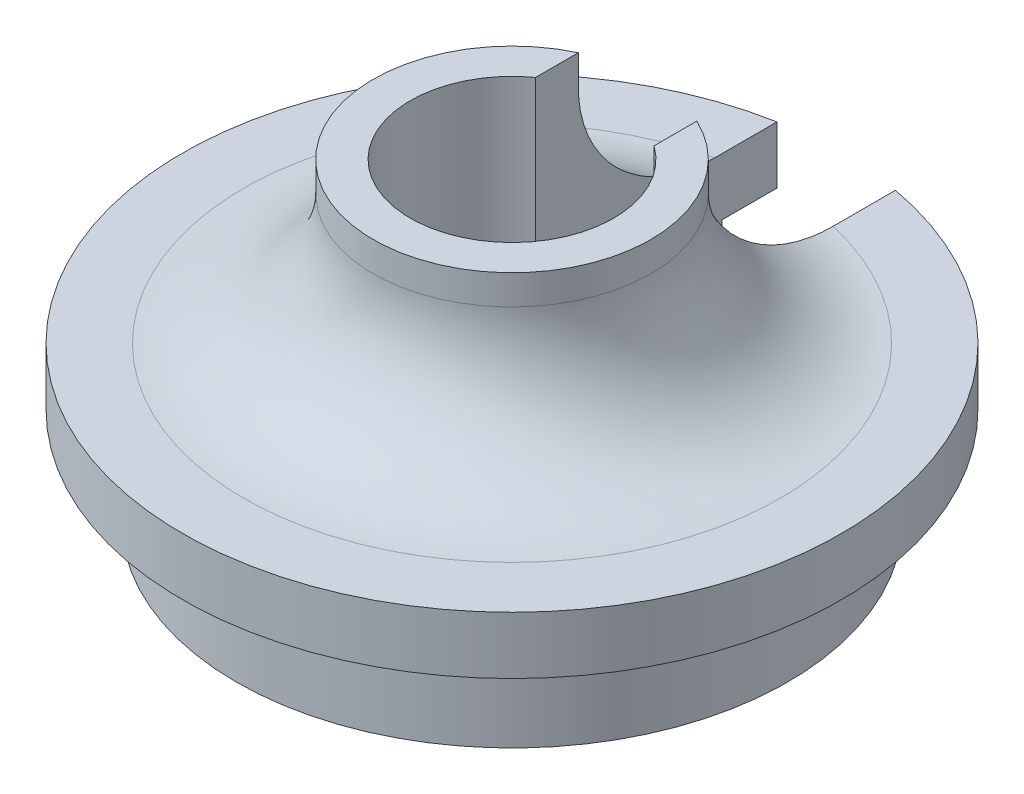
ISO-10303-21;
HEADER;
FILE_DESCRIPTION(('STEP AP214'),'2;1');
FILE_NAME('part.step','',(''),(''),'','','');
FILE_SCHEMA(('AUTOMOTIVE_DESIGN { 1 0 10303 214 1 1 1 1 }'));
ENDSEC;
DATA;
#1=APPLICATION_CONTEXT('core data for automotive mechanical design processes');
#2=APPLICATION_PROTOCOL_DEFINITION('international standard','automotive_design',2000,#1);
#3=PRODUCT_CONTEXT('',#1,'mechanical');
#4=PRODUCT('Part','Part','',(#3));
#5=PRODUCT_RELATED_PRODUCT_CATEGORY('part','',(#4));
#6=PRODUCT_DEFINITION_FORMATION('','',#4);
#7=PRODUCT_DEFINITION_CONTEXT('part definition',#1,'design');
#8=PRODUCT_DEFINITION('design','',#6,#7);
#9=PRODUCT_DEFINITION_SHAPE('','',#8);
#10=(LENGTH_UNIT() NAMED_UNIT(*) SI_UNIT(.MILLI.,.METRE.));
#11=(NAMED_UNIT(*) PLANE_ANGLE_UNIT() SI_UNIT($,.RADIAN.));
#12=(NAMED_UNIT(*) SI_UNIT($,.STERADIAN.) SOLID_ANGLE_UNIT());
#13=UNCERTAINTY_MEASURE_WITH_UNIT(LENGTH_MEASURE(1.E-05),#10,'distance_accuracy_value','');
#14=(GEOMETRIC_REPRESENTATION_CONTEXT(3) GLOBAL_UNCERTAINTY_ASSIGNED_CONTEXT((#13)) GLOBAL_UNIT_ASSIGNED_CONTEXT((#10,
#11,#12)) REPRESENTATION_CONTEXT('',''));
#15=CARTESIAN_POINT('',(0.,0.,0.));
#16=DIRECTION('',(0.,0.,1.));
#17=DIRECTION('',(1.,0.,0.));
#18=AXIS2_PLACEMENT_3D('',#15,#16,#17);
#19=CARTESIAN_POINT('',(0.,-1.55,-6.65));
#20=DIRECTION('',(0.,-1.,0.));
#21=DIRECTION('',(0.,0.,-1.));
#22=AXIS2_PLACEMENT_3D('',#19,#20,#21);
#23=PLANE('',#22);
#24=CARTESIAN_POINT('',(4.3301270189222,-1.55,-2.49999999999998));
#25=DIRECTION('',(0.,-1.,0.));
#26=DIRECTION('',(0.,0.,-1.));
#27=AXIS2_PLACEMENT_3D('',#24,#25,#26);
#28=CIRCLE('',#27,0.999999999999996);
#29=CARTESIAN_POINT('',(4.3301270189222,-1.55,-3.49999999999997));
#30=VERTEX_POINT('',#29);
#31=EDGE_CURVE('E350',#30,#30,#28,.T.);
#32=ORIENTED_EDGE('',*,*,#31,.F.);
#33=EDGE_LOOP('',(#32));
#34=FACE_BOUND('',#33,.T.);
#35=CARTESIAN_POINT('',(4.3301270189222,-1.55,2.50000000000003));
#36=DIRECTION('',(0.,-1.,0.));
#37=DIRECTION('',(0.,0.,-1.));
#38=AXIS2_PLACEMENT_3D('',#35,#36,#37);
#39=CIRCLE('',#38,0.999999999999994);
#40=CARTESIAN_POINT('',(4.3301270189222,-1.55,1.50000000000004));
#41=VERTEX_POINT('',#40);
#42=EDGE_CURVE('E354',#41,#41,#39,.T.);
#43=ORIENTED_EDGE('',*,*,#42,.F.);
#44=EDGE_LOOP('',(#43));
#45=FACE_BOUND('',#44,.T.);
#46=CARTESIAN_POINT('',(0.,-1.55,5.00000000000004));
#47=DIRECTION('',(0.,-1.,0.));
#48=DIRECTION('',(0.,0.,-1.));
#49=AXIS2_PLACEMENT_3D('',#46,#47,#48);
#50=CIRCLE('',#49,0.999999999999994);
#51=CARTESIAN_POINT('',(0.,-1.55,4.00000000000005));
#52=VERTEX_POINT('',#51);
#53=EDGE_CURVE('E358',#52,#52,#50,.T.);
#54=ORIENTED_EDGE('',*,*,#53,.F.);
#55=EDGE_LOOP('',(#54));
#56=FACE_BOUND('',#55,.T.);
#57=CARTESIAN_POINT('',(-4.3301270189222,-1.55,2.50000000000004));
#58=DIRECTION('',(0.,-1.,0.));
#59=DIRECTION('',(0.,0.,-1.));
#60=AXIS2_PLACEMENT_3D('',#57,#58,#59);
#61=CIRCLE('',#60,0.999999999999999);
#62=CARTESIAN_POINT('',(-4.3301270189222,-1.55,1.50000000000004));
#63=VERTEX_POINT('',#62);
#64=EDGE_CURVE('E362',#63,#63,#61,.T.);
#65=ORIENTED_EDGE('',*,*,#64,.F.);
#66=EDGE_LOOP('',(#65));
#67=FACE_BOUND('',#66,.T.);
#68=CARTESIAN_POINT('',(-4.33012701892221,-1.55,-2.49999999999997));
#69=DIRECTION('',(0.,-1.,0.));
#70=DIRECTION('',(0.,0.,-1.));
#71=AXIS2_PLACEMENT_3D('',#68,#69,#70);
#72=CIRCLE('',#71,1.);
#73=CARTESIAN_POINT('',(-4.33012701892221,-1.55,-3.49999999999997));
#74=VERTEX_POINT('',#73);
#75=EDGE_CURVE('E366',#74,#74,#72,.T.);
#76=ORIENTED_EDGE('',*,*,#75,.F.);
#77=EDGE_LOOP('',(#76));
#78=FACE_BOUND('',#77,.T.);
#79=DIRECTION('',(0.,0.,1.));
#80=VECTOR('',#79,1.);
#81=CARTESIAN_POINT('',(1.6,-1.55,-6.65));
#82=LINE('',#81,#80);
#83=CARTESIAN_POINT('',(1.6,-1.55,-6.45464948699773));
#84=VERTEX_POINT('',#83);
#85=CARTESIAN_POINT('',(1.6,-1.55,0.));
#86=VERTEX_POINT('',#85);
#87=EDGE_CURVE('E185',#84,#86,#82,.T.);
#88=ORIENTED_EDGE('',*,*,#87,.F.);
#89=CARTESIAN_POINT('',(0.,-1.55,0.));
#90=DIRECTION('',(0.,-1.,0.));
#91=DIRECTION('',(0.,0.,-1.));
#92=AXIS2_PLACEMENT_3D('',#89,#90,#91);
#93=CIRCLE('',#92,6.65);
#94=CARTESIAN_POINT('',(-1.6,-1.55,-6.45464948699773));
#95=VERTEX_POINT('',#94);
#96=EDGE_CURVE('E160',#84,#95,#93,.T.);
#97=ORIENTED_EDGE('',*,*,#96,.T.);
#98=DIRECTION('',(0.,0.,-1.));
#99=VECTOR('',#98,1.);
#100=CARTESIAN_POINT('',(-1.6,-1.55,-6.65));
#101=LINE('',#100,#99);
#102=CARTESIAN_POINT('',(-1.6,-1.55,0.));
#103=VERTEX_POINT('',#102);
#104=EDGE_CURVE('E138',#103,#95,#101,.T.);
#105=ORIENTED_EDGE('',*,*,#104,.F.);
#106=CARTESIAN_POINT('',(0.,-1.55,0.));
#107=DIRECTION('',(0.,-1.,0.));
#108=DIRECTION('',(0.,0.,-1.));
#109=AXIS2_PLACEMENT_3D('',#106,#107,#108);
#110=CIRCLE('',#109,1.6);
#111=EDGE_CURVE('E195',#86,#103,#110,.T.);
#112=ORIENTED_EDGE('',*,*,#111,.F.);
#113=EDGE_LOOP('',(#88,#97,#105,#112));
#114=FACE_BOUND('',#113,.T.);
#115=ADVANCED_FACE('F39',(#34,#45,#56,#67,#78,#114),#23,.T.);
#116=CARTESIAN_POINT('',(0.,-1.55,0.));
#117=DIRECTION('',(0.,-1.,0.));
#118=DIRECTION('',(0.,0.,-1.));
#119=AXIS2_PLACEMENT_3D('',#116,#117,#118);
#120=CYLINDRICAL_SURFACE('',#119,6.65);
#121=DIRECTION('',(0.,-1.,0.));
#122=VECTOR('',#121,1.);
#123=CARTESIAN_POINT('',(1.6,-1.55,-6.45464948699773));
#124=LINE('',#123,#122);
#125=CARTESIAN_POINT('',(1.6,-4.2,-6.45464948699773));
#126=VERTEX_POINT('',#125);
#127=EDGE_CURVE('E62',#126,#84,#124,.F.);
#128=ORIENTED_EDGE('',*,*,#127,.F.);
#129=CARTESIAN_POINT('',(0.,-4.2,0.));
#130=DIRECTION('',(0.,-1.,0.));
#131=DIRECTION('',(0.,0.,-1.));
#132=AXIS2_PLACEMENT_3D('',#129,#130,#131);
#133=CIRCLE('',#132,6.65);
#134=CARTESIAN_POINT('',(-1.6,-4.2,-6.45464948699773));
#135=VERTEX_POINT('',#134);
#136=EDGE_CURVE('E151',#126,#135,#133,.T.);
#137=ORIENTED_EDGE('',*,*,#136,.T.);
#138=DIRECTION('',(0.,-1.,0.));
#139=VECTOR('',#138,1.);
#140=CARTESIAN_POINT('',(-1.6,-1.55,-6.45464948699773));
#141=LINE('',#140,#139);
#142=EDGE_CURVE('E131',#95,#135,#141,.T.);
#143=ORIENTED_EDGE('',*,*,#142,.F.);
#144=ORIENTED_EDGE('',*,*,#96,.F.);
#145=EDGE_LOOP('',(#128,#137,#143,#144));
#146=FACE_BOUND('',#145,.T.);
#147=ADVANCED_FACE('F158',(#146),#120,.F.);
#148=CARTESIAN_POINT('',(0.,-4.2,-7.45));
#149=DIRECTION('',(0.,-1.,0.));
#150=DIRECTION('',(0.,0.,-1.));
#151=AXIS2_PLACEMENT_3D('',#148,#149,#150);
#152=PLANE('',#151);
#153=DIRECTION('',(0.,0.,1.));
#154=VECTOR('',#153,1.);
#155=CARTESIAN_POINT('',(1.6,-4.2,0.));
#156=LINE('',#155,#154);
#157=CARTESIAN_POINT('',(1.6,-4.2,-7.27615970138094));
#158=VERTEX_POINT('',#157);
#159=EDGE_CURVE('E155',#158,#126,#156,.T.);
#160=ORIENTED_EDGE('',*,*,#159,.F.);
#161=CARTESIAN_POINT('',(0.,-4.2,0.));
#162=DIRECTION('',(0.,-1.,0.));
#163=DIRECTION('',(0.,0.,-1.));
#164=AXIS2_PLACEMENT_3D('',#161,#162,#163);
#165=CIRCLE('',#164,7.45);
#166=CARTESIAN_POINT('',(-1.6,-4.2,-7.27615970138094));
#167=VERTEX_POINT('',#166);
#168=EDGE_CURVE('E153',#158,#167,#165,.T.);
#169=ORIENTED_EDGE('',*,*,#168,.T.);
#170=DIRECTION('',(0.,0.,-1.));
#171=VECTOR('',#170,1.);
#172=CARTESIAN_POINT('',(-1.6,-4.2,0.));
#173=LINE('',#172,#171);
#174=EDGE_CURVE('E134',#135,#167,#173,.T.);
#175=ORIENTED_EDGE('',*,*,#174,.F.);
#176=ORIENTED_EDGE('',*,*,#136,.F.);
#177=EDGE_LOOP('',(#160,#169,#175,#176));
#178=FACE_BOUND('',#177,.T.);
#179=ADVANCED_FACE('F150',(#178),#152,.T.);
#180=CARTESIAN_POINT('',(0.,-1.55,0.));
#181=DIRECTION('',(0.,-1.,0.));
#182=DIRECTION('',(0.,0.,-1.));
#183=AXIS2_PLACEMENT_3D('',#180,#181,#182);
#184=CYLINDRICAL_SURFACE('',#183,7.45);
#185=DIRECTION('',(0.,-1.,0.));
#186=VECTOR('',#185,1.);
#187=CARTESIAN_POINT('',(1.6,-1.55,-7.27615970138094));
#188=LINE('',#187,#186);
#189=CARTESIAN_POINT('',(1.6,-1.55,-7.27615970138094));
#190=VERTEX_POINT('',#189);
#191=EDGE_CURVE('E229',#190,#158,#188,.T.);
#192=ORIENTED_EDGE('',*,*,#191,.F.);
#193=CARTESIAN_POINT('',(0.,-1.55,0.));
#194=DIRECTION('',(0.,-1.,0.));
#195=DIRECTION('',(0.,0.,-1.));
#196=AXIS2_PLACEMENT_3D('',#193,#194,#195);
#197=CIRCLE('',#196,7.45);
#198=CARTESIAN_POINT('',(-1.6,-1.55,-7.27615970138094));
#199=VERTEX_POINT('',#198);
#200=EDGE_CURVE('E166',#190,#199,#197,.T.);
#201=ORIENTED_EDGE('',*,*,#200,.T.);
#202=DIRECTION('',(0.,-1.,0.));
#203=VECTOR('',#202,1.);
#204=CARTESIAN_POINT('',(-1.6,-1.55,-7.27615970138094));
#205=LINE('',#204,#203);
#206=EDGE_CURVE('E144',#167,#199,#205,.F.);
#207=ORIENTED_EDGE('',*,*,#206,.F.);
#208=ORIENTED_EDGE('',*,*,#168,.F.);
#209=EDGE_LOOP('',(#192,#201,#207,#208));
#210=FACE_BOUND('',#209,.T.);
#211=ADVANCED_FACE('F228',(#210),#184,.T.);
#212=CARTESIAN_POINT('',(0.,-1.55,-8.9));
#213=DIRECTION('',(0.,-1.,0.));
#214=DIRECTION('',(0.,0.,-1.));
#215=AXIS2_PLACEMENT_3D('',#212,#213,#214);
#216=PLANE('',#215);
#217=DIRECTION('',(0.,0.,1.));
#218=VECTOR('',#217,1.);
#219=CARTESIAN_POINT('',(1.6,-1.55,-8.9));
#220=LINE('',#219,#218);
#221=CARTESIAN_POINT('',(1.6,-1.55,-8.75499857224431));
#222=VERTEX_POINT('',#221);
#223=EDGE_CURVE('E234',#222,#190,#220,.T.);
#224=ORIENTED_EDGE('',*,*,#223,.F.);
#225=CARTESIAN_POINT('',(0.,-1.55,0.));
#226=DIRECTION('',(0.,-1.,0.));
#227=DIRECTION('',(0.,0.,-1.));
#228=AXIS2_PLACEMENT_3D('',#225,#226,#227);
#229=CIRCLE('',#228,8.9);
#230=CARTESIAN_POINT('',(-1.6,-1.55,-8.75499857224431));
#231=VERTEX_POINT('',#230);
#232=EDGE_CURVE('E220',#222,#231,#229,.T.);
#233=ORIENTED_EDGE('',*,*,#232,.T.);
#234=DIRECTION('',(0.,0.,-1.));
#235=VECTOR('',#234,1.);
#236=CARTESIAN_POINT('',(-1.6,-1.55,-8.9));
#237=LINE('',#236,#235);
#238=EDGE_CURVE('E236',#199,#231,#237,.T.);
#239=ORIENTED_EDGE('',*,*,#238,.F.);
#240=ORIENTED_EDGE('',*,*,#200,.F.);
#241=EDGE_LOOP('',(#224,#233,#239,#240));
#242=FACE_BOUND('',#241,.T.);
#243=ADVANCED_FACE('F233',(#242),#216,.T.);
#244=CARTESIAN_POINT('',(0.,-1.55,0.));
#245=DIRECTION('',(0.,-1.,0.));
#246=DIRECTION('',(0.,0.,-1.));
#247=AXIS2_PLACEMENT_3D('',#244,#245,#246);
#248=CYLINDRICAL_SURFACE('',#247,8.9);
#249=DIRECTION('',(0.,-1.,0.));
#250=VECTOR('',#249,1.);
#251=CARTESIAN_POINT('',(1.6,-1.55,-8.75499857224431));
#252=LINE('',#251,#250);
#253=CARTESIAN_POINT('',(1.6,0.,-8.75499857224431));
#254=VERTEX_POINT('',#253);
#255=EDGE_CURVE('E303',#254,#222,#252,.T.);
#256=ORIENTED_EDGE('',*,*,#255,.F.);
#257=CARTESIAN_POINT('',(0.,0.,0.));
#258=DIRECTION('',(0.,-1.,0.));
#259=DIRECTION('',(0.,0.,-1.));
#260=AXIS2_PLACEMENT_3D('',#257,#258,#259);
#261=CIRCLE('',#260,8.9);
#262=CARTESIAN_POINT('',(-1.6,0.,-8.75499857224431));
#263=VERTEX_POINT('',#262);
#264=EDGE_CURVE('E216',#254,#263,#261,.T.);
#265=ORIENTED_EDGE('',*,*,#264,.T.);
#266=DIRECTION('',(0.,-1.,0.));
#267=VECTOR('',#266,1.);
#268=CARTESIAN_POINT('',(-1.6,-1.55,-8.75499857224431));
#269=LINE('',#268,#267);
#270=EDGE_CURVE('E239',#231,#263,#269,.F.);
#271=ORIENTED_EDGE('',*,*,#270,.F.);
#272=ORIENTED_EDGE('',*,*,#232,.F.);
#273=EDGE_LOOP('',(#256,#265,#271,#272));
#274=FACE_BOUND('',#273,.T.);
#275=ADVANCED_FACE('F539',(#274),#248,.T.);
#276=CARTESIAN_POINT('',(0.,0.,-7.25000000000003));
#277=DIRECTION('',(0.,1.,0.));
#278=DIRECTION('',(0.,0.,1.));
#279=AXIS2_PLACEMENT_3D('',#276,#277,#278);
#280=PLANE('',#279);
#281=DIRECTION('',(0.,0.,-1.));
#282=VECTOR('',#281,1.);
#283=CARTESIAN_POINT('',(1.6,0.,-7.25000000000003));
#284=LINE('',#283,#282);
#285=CARTESIAN_POINT('',(1.6,-1.83360038236289E-12,-7.0712445863513));
#286=VERTEX_POINT('',#285);
#287=EDGE_CURVE('E264',#286,#254,#284,.T.);
#288=ORIENTED_EDGE('',*,*,#287,.F.);
#289=CARTESIAN_POINT('',(0.,0.,0.));
#290=DIRECTION('',(0.,-1.,0.));
#291=DIRECTION('',(0.,0.,-1.));
#292=AXIS2_PLACEMENT_3D('',#289,#290,#291);
#293=CIRCLE('',#292,7.25000000000003);
#294=CARTESIAN_POINT('',(-1.6,0.,-7.07124458635114));
#295=VERTEX_POINT('',#294);
#296=EDGE_CURVE('E212',#286,#295,#293,.T.);
#297=ORIENTED_EDGE('',*,*,#296,.T.);
#298=DIRECTION('',(0.,0.,1.));
#299=VECTOR('',#298,1.);
#300=CARTESIAN_POINT('',(-1.6,0.,-7.25000000000003));
#301=LINE('',#300,#299);
#302=EDGE_CURVE('E244',#263,#295,#301,.T.);
#303=ORIENTED_EDGE('',*,*,#302,.F.);
#304=ORIENTED_EDGE('',*,*,#264,.F.);
#305=EDGE_LOOP('',(#288,#297,#303,#304));
#306=FACE_BOUND('',#305,.T.);
#307=ADVANCED_FACE('F300',(#306),#280,.T.);
#308=CARTESIAN_POINT('',(0.,3.5,0.));
#309=DIRECTION('',(0.,-1.,0.));
#310=DIRECTION('',(0.,0.,-1.));
#311=AXIS2_PLACEMENT_3D('',#308,#309,#310);
#312=TOROIDAL_SURFACE('',#311,7.25,3.5);
#313=CARTESIAN_POINT('',(1.6,0.117608452920634,-6.1454487769045));
#314=CARTESIAN_POINT('',(1.6,0.0660710673688342,-6.34569935766424));
#315=CARTESIAN_POINT('',(1.6,0.0311052071216723,-6.55036182288609));
#316=CARTESIAN_POINT('',(1.6,-0.00420460237277215,-6.9628222154944));
#317=CARTESIAN_POINT('',(1.6,-0.00451269686021638,-7.17062316756475));
#318=CARTESIAN_POINT('',(1.6,0.0300255986005682,-7.58344275388472));
#319=CARTESIAN_POINT('',(1.6,0.0648916561461692,-7.78845976650036));
#320=CARTESIAN_POINT('',(1.6,0.169221502993227,-8.18945735404376));
#321=CARTESIAN_POINT('',(1.6,0.238675586638898,-8.38544044711017));
#322=CARTESIAN_POINT('',(1.6,0.408864010831063,-8.75892845256637));
#323=CARTESIAN_POINT('',(1.6,0.508993228377087,-8.93670901946503));
#324=CARTESIAN_POINT('',(1.6,0.738261301156603,-9.27247479319244));
#325=CARTESIAN_POINT('',(1.6,0.867398038385774,-9.4304614439765));
#326=CARTESIAN_POINT('',(1.6,1.14817428135122,-9.71883092734555));
#327=CARTESIAN_POINT('',(1.6,1.29931100501729,-9.84970346590975));
#328=CARTESIAN_POINT('',(1.6,1.6216648806939,-10.0837987651404));
#329=CARTESIAN_POINT('',(1.6,1.79288034845252,-10.1870238425585));
#330=CARTESIAN_POINT('',(1.6,2.14802576282548,-10.3614877963656));
#331=CARTESIAN_POINT('',(1.6,2.33175316534695,-10.4331391592439));
#332=CARTESIAN_POINT('',(1.6,2.70868209739808,-10.5443198669925));
#333=CARTESIAN_POINT('',(1.6,2.90188316420359,-10.5838507790749));
#334=CARTESIAN_POINT('',(1.6,3.29074075191463,-10.6294317565768));
#335=CARTESIAN_POINT('',(1.6,3.48636852707364,-10.6357273889073));
#336=CARTESIAN_POINT('',(1.6,3.87589191202113,-10.6153136705418));
#337=CARTESIAN_POINT('',(1.6,4.06978755550172,-10.5886049632354));
#338=CARTESIAN_POINT('',(1.6,4.44994859936518,-10.5030637977755));
#339=CARTESIAN_POINT('',(1.6,4.63622838407386,-10.4442952212439));
#340=CARTESIAN_POINT('',(1.6,4.996320893774,-10.2964138189762));
#341=CARTESIAN_POINT('',(1.6,5.17013356832481,-10.2073008704782));
#342=CARTESIAN_POINT('',(1.6,5.50098577445076,-10.001014370378));
#343=CARTESIAN_POINT('',(1.6,5.65797025758821,-9.88375256074454));
#344=CARTESIAN_POINT('',(1.6,5.95022881842182,-9.62474279605597));
#345=CARTESIAN_POINT('',(1.6,6.08550225933839,-9.48299412306017));
#346=CARTESIAN_POINT('',(1.6,6.33179393057284,-9.17778119127736));
#347=CARTESIAN_POINT('',(1.6,6.44259435514491,-9.01414123813584));
#348=CARTESIAN_POINT('',(1.6,6.63559582136034,-8.67079668677822));
#349=CARTESIAN_POINT('',(1.6,6.71779527060576,-8.49109119479149));
#350=CARTESIAN_POINT('',(1.6,6.85260571165583,-8.11795784686793));
#351=CARTESIAN_POINT('',(1.6,6.90476998977001,-7.92436869365263));
#352=CARTESIAN_POINT('',(1.6,6.97656887087306,-7.53125981324843));
#353=CARTESIAN_POINT('',(1.6,6.9962004748447,-7.33173954102625));
#354=CARTESIAN_POINT('',(1.6,7.00286556065942,-6.92803310122266));
#355=CARTESIAN_POINT('',(1.6,6.98921654420028,-6.7238357673926));
#356=CARTESIAN_POINT('',(1.6,6.92868328557855,-6.32043521698272));
#357=CARTESIAN_POINT('',(1.6,6.88179489815635,-6.12123262650236));
#358=CARTESIAN_POINT('',(1.6,6.75484268520536,-5.72828799049918));
#359=CARTESIAN_POINT('',(1.6,6.67399393979352,-5.53479943102493));
#360=CARTESIAN_POINT('',(1.6,6.48151713443159,-5.16376250025473));
#361=CARTESIAN_POINT('',(1.6,6.36988309316312,-4.98621723549932));
#362=CARTESIAN_POINT('',(1.6,6.1166355721106,-4.64910334739217));
#363=CARTESIAN_POINT('',(1.6,5.9745397498925,-4.48989619106512));
#364=CARTESIAN_POINT('',(1.6,5.66520072446307,-4.19806847387328));
#365=CARTESIAN_POINT('',(1.6,5.49795440855428,-4.06545120859686));
#366=CARTESIAN_POINT('',(1.6,5.145830732866,-3.83416419907122));
#367=CARTESIAN_POINT('',(1.6,4.96135901763265,-3.73488499990697));
#368=CARTESIAN_POINT('',(1.6,4.67361324667264,-3.61259213677427));
#369=CARTESIAN_POINT('',(1.6,4.57583201021464,-3.57625965256293));
#370=CARTESIAN_POINT('',(1.6,4.37729692811017,-3.51297726664588));
#371=CARTESIAN_POINT('',(1.6,4.27654473552971,-3.48602225023807));
#372=CARTESIAN_POINT('',(1.6,4.08101298911954,-3.4437047865398));
#373=CARTESIAN_POINT('',(1.6,3.98639494393106,-3.42759141672691));
#374=CARTESIAN_POINT('',(1.6,3.79612983945301,-3.40395831647535));
#375=CARTESIAN_POINT('',(1.6,3.7004832860333,-3.39643454036498));
#376=CARTESIAN_POINT('',(1.6,3.50891606021146,-3.39009626859963));
#377=CARTESIAN_POINT('',(1.6,3.41299542893442,-3.39128052853242));
#378=CARTESIAN_POINT('',(1.6,3.22165938565353,-3.4023341007233));
#379=CARTESIAN_POINT('',(1.6,3.12624395932024,-3.41220316530684));
#380=CARTESIAN_POINT('',(1.6,2.94302170666345,-3.43951922642801));
#381=CARTESIAN_POINT('',(1.6,2.85513248473907,-3.45641581915451));
#382=CARTESIAN_POINT('',(1.6,2.68103552443629,-3.49739457335282));
#383=CARTESIAN_POINT('',(1.6,2.59482837480535,-3.52147920431753));
#384=CARTESIAN_POINT('',(1.6,2.33959923782741,-3.6040815303684));
#385=CARTESIAN_POINT('',(1.6,2.17382515752989,-3.67296976852611));
#386=CARTESIAN_POINT('',(1.6,1.84861230013531,-3.83866867635258));
#387=CARTESIAN_POINT('',(1.6,1.68969276165664,-3.93648669426085));
#388=CARTESIAN_POINT('',(1.6,1.38870537202161,-4.15538876677336));
#389=CARTESIAN_POINT('',(1.6,1.24664687793803,-4.27648564328913));
#390=CARTESIAN_POINT('',(1.6,0.970592773185042,-4.5500412902363));
#391=CARTESIAN_POINT('',(1.6,0.838400266782409,-4.70432014203126));
#392=CARTESIAN_POINT('',(1.6,0.60049566705133,-5.03192542296858));
#393=CARTESIAN_POINT('',(1.6,0.494760199800747,-5.20523484303632));
#394=CARTESIAN_POINT('',(1.6,0.342436742038391,-5.50678254267111));
#395=CARTESIAN_POINT('',(1.6,0.287841003962251,-5.63104489418721));
#396=CARTESIAN_POINT('',(1.6,0.192324148857723,-5.88472194998596));
#397=CARTESIAN_POINT('',(1.6,0.151403484542809,-6.01413682468426));
#398=CARTESIAN_POINT('',(1.6,0.117608452920634,-6.1454487769045));
#399=B_SPLINE_CURVE_WITH_KNOTS('',3,(#313,#314,#315,#316,#317,#318,#319,#320,#321,#322,#323,
#324,#325,#326,#327,#328,#329,#330,#331,#332,#333,#334,#335,#336,#337,#338,#339,#340,#341,#342,
#343,#344,#345,#346,#347,#348,#349,#350,#351,#352,#353,#354,#355,#356,#357,#358,#359,#360,#361,
#362,#363,#364,#365,#366,#367,#368,#369,#370,#371,#372,#373,#374,#375,#376,#377,#378,#379,#380,
#381,#382,#383,#384,#385,#386,#387,#388,#389,#390,#391,#392,#393,#394,#395,#396,#397,#398),
.UNSPECIFIED.,.T.,.F.,(4,2,2,2,2,2,2,2,2,2,2,2,2,2,2,2,2,2,2,2,2,2,2,2,2,2,2,2,2,2,2,2,2,2,2,2,
2,2,2,2,2,2,4),(0.,0.619848991603898,1.24033923436945,1.86117661613103,2.48183988441434,
3.09097197815105,3.7000596101311,4.29694189465271,4.89377414705962,5.48255967888891,
6.07131648113328,6.65571695986145,7.24010604641399,7.82333492592664,8.40656616499061,
8.99165051937249,9.57675203100116,10.1668679384723,10.757016696188,11.3557299685086,
11.9544984300076,12.565648947247,13.1768756940675,13.803082769709,14.4294115978266,
15.0665066186164,15.7036805531108,16.3284759483871,16.6410327078479,16.9534187228879,
17.2409839114819,17.5284136018241,17.8158022181442,18.1031826389385,18.3713608850239,
18.6396313715938,19.1757393084024,19.733307643073,20.2911839688998,20.8980431358381,
21.5043642545234,21.9108094527399,22.3172681049968),.UNSPECIFIED.);
#400=CARTESIAN_POINT('',(1.6,3.50000000000002,-3.39153357642232));
#401=VERTEX_POINT('',#400);
#402=EDGE_CURVE('E256',#401,#286,#399,.T.);
#403=ORIENTED_EDGE('',*,*,#402,.F.);
#404=CARTESIAN_POINT('',(0.,3.50000000000002,0.));
#405=DIRECTION('',(0.,-1.,0.));
#406=DIRECTION('',(0.,0.,-1.));
#407=AXIS2_PLACEMENT_3D('',#404,#405,#406);
#408=CIRCLE('',#407,3.75);
#409=CARTESIAN_POINT('',(-1.6,3.50000000000002,-3.39153357642232));
#410=VERTEX_POINT('',#409);
#411=EDGE_CURVE('E208',#401,#410,#408,.T.);
#412=ORIENTED_EDGE('',*,*,#411,.T.);
#413=CARTESIAN_POINT('',(-1.6,0.117608452920634,-6.1454487769045));
#414=CARTESIAN_POINT('',(-1.6,0.170439935768936,-5.94024205514774));
#415=CARTESIAN_POINT('',(-1.6,0.240757438598814,-5.73935841749723));
#416=CARTESIAN_POINT('',(-1.6,0.414115767621047,-5.35200537326034));
#417=CARTESIAN_POINT('',(-1.6,0.517205841233714,-5.16555818813378));
#418=CARTESIAN_POINT('',(-1.6,0.753108142007033,-4.81259589549563));
#419=CARTESIAN_POINT('',(-1.6,0.885906810828547,-4.64607174859501));
#420=CARTESIAN_POINT('',(-1.6,1.17775293572978,-4.33792009403036));
#421=CARTESIAN_POINT('',(-1.6,1.33679674763862,-4.19628913554632));
#422=CARTESIAN_POINT('',(-1.6,1.67566936021814,-3.94411018119603));
#423=CARTESIAN_POINT('',(-1.6,1.8552763755224,-3.83326784191449));
#424=CARTESIAN_POINT('',(-1.6,2.13728683648787,-3.69284016261146));
#425=CARTESIAN_POINT('',(-1.6,2.23342556416554,-3.65032673041564));
#426=CARTESIAN_POINT('',(-1.6,2.42923754167272,-3.5744714747319));
#427=CARTESIAN_POINT('',(-1.6,2.52890883791885,-3.54112466857134));
#428=CARTESIAN_POINT('',(-1.6,2.72379616611807,-3.48616190925559));
#429=CARTESIAN_POINT('',(-1.6,2.81882530899936,-3.46388061213753));
#430=CARTESIAN_POINT('',(-1.6,3.01047508327128,-3.42803982383125));
#431=CARTESIAN_POINT('',(-1.6,3.1070949206279,-3.41447610879613));
#432=CARTESIAN_POINT('',(-1.6,3.30114396946644,-3.39628704884345));
#433=CARTESIAN_POINT('',(-1.6,3.39857292652892,-3.39165899367098));
#434=CARTESIAN_POINT('',(-1.6,3.59343867485659,-3.39141319916916));
#435=CARTESIAN_POINT('',(-1.6,3.69087546552321,-3.39579502837105));
#436=CARTESIAN_POINT('',(-1.6,3.87735472716211,-3.41280187834231));
#437=CARTESIAN_POINT('',(-1.6,3.96645873423683,-3.42475672672692));
#438=CARTESIAN_POINT('',(-1.6,4.14336218790841,-3.45608038451932));
#439=CARTESIAN_POINT('',(-1.6,4.23116119770999,-3.47545162068858));
#440=CARTESIAN_POINT('',(-1.6,4.49167471194343,-3.54432965195349));
#441=CARTESIAN_POINT('',(-1.6,4.66165325053212,-3.60461474478038));
#442=CARTESIAN_POINT('',(-1.6,4.99359278905469,-3.75274960845404));
#443=CARTESIAN_POINT('',(-1.6,5.15528595380818,-3.84119126588925));
#444=CARTESIAN_POINT('',(-1.6,5.46318184529222,-4.0418496674638));
#445=CARTESIAN_POINT('',(-1.6,5.60937987752803,-4.15407358610182));
#446=CARTESIAN_POINT('',(-1.6,5.89543791249707,-4.40971088155597));
#447=CARTESIAN_POINT('',(-1.6,6.0336302934882,-4.55499184130688));
#448=CARTESIAN_POINT('',(-1.6,6.2852760519552,-4.86561179699287));
#449=CARTESIAN_POINT('',(-1.6,6.39872214484082,-5.03095667693291));
#450=CARTESIAN_POINT('',(-1.6,6.60374611930037,-5.3872128631731));
#451=CARTESIAN_POINT('',(-1.6,6.69374190595266,-5.57903771554338));
#452=CARTESIAN_POINT('',(-1.6,6.84040238872576,-5.97504804049887));
#453=CARTESIAN_POINT('',(-1.6,6.89706519552583,-6.17923421300315));
#454=CARTESIAN_POINT('',(-1.6,6.97522528734753,-6.59503436108747));
#455=CARTESIAN_POINT('',(-1.6,6.99659304277566,-6.80667279802734));
#456=CARTESIAN_POINT('',(-1.6,7.00265332285461,-7.23048586076352));
#457=CARTESIAN_POINT('',(-1.6,6.98734939630859,-7.44266043269188));
#458=CARTESIAN_POINT('',(-1.6,6.92079282435222,-7.8565702645605));
#459=CARTESIAN_POINT('',(-1.6,6.8703286185562,-8.05843218500547));
#460=CARTESIAN_POINT('',(-1.6,6.73538090754676,-8.450452390475));
#461=CARTESIAN_POINT('',(-1.6,6.6509018750827,-8.6406122104683));
#462=CARTESIAN_POINT('',(-1.6,6.45258316911775,-8.99894241489388));
#463=CARTESIAN_POINT('',(-1.6,6.33950363061376,-9.16753362937415));
#464=CARTESIAN_POINT('',(-1.6,6.08614459590531,-9.48286622491086));
#465=CARTESIAN_POINT('',(-1.6,5.94586802988746,-9.62960995678973));
#466=CARTESIAN_POINT('',(-1.6,5.64495634174601,-9.89423364924831));
#467=CARTESIAN_POINT('',(-1.6,5.48474904175372,-10.0126002783604));
#468=CARTESIAN_POINT('',(-1.6,5.14653944839568,-10.2203688879871));
#469=CARTESIAN_POINT('',(-1.6,4.96853843647373,-10.3097729523254));
#470=CARTESIAN_POINT('',(-1.6,4.60211635372752,-10.4560081057722));
#471=CARTESIAN_POINT('',(-1.6,4.41384658232212,-10.5132184931838));
#472=CARTESIAN_POINT('',(-1.6,4.03034804958564,-10.5950014079274));
#473=CARTESIAN_POINT('',(-1.6,3.83511958210688,-10.6195753117626));
#474=CARTESIAN_POINT('',(-1.6,3.44452513589053,-10.635300607607));
#475=CARTESIAN_POINT('',(-1.6,3.24916733770243,-10.6266559761565));
#476=CARTESIAN_POINT('',(-1.6,2.86268558153435,-10.576660078589));
#477=CARTESIAN_POINT('',(-1.6,2.67156156822989,-10.5353092401161));
#478=CARTESIAN_POINT('',(-1.6,2.29911785823189,-10.4211751158424));
#479=CARTESIAN_POINT('',(-1.6,2.11779026848215,-10.3484175728072));
#480=CARTESIAN_POINT('',(-1.6,1.76985200991981,-10.1736191490283));
#481=CARTESIAN_POINT('',(-1.6,1.60324153149013,-10.0715778895382));
#482=CARTESIAN_POINT('',(-1.6,1.28864656552977,-9.84068559334407));
#483=CARTESIAN_POINT('',(-1.6,1.1407468160456,-9.7117191391778));
#484=CARTESIAN_POINT('',(-1.6,0.86845144142298,-9.43100905669488));
#485=CARTESIAN_POINT('',(-1.6,0.744055648053701,-9.27926559141987));
#486=CARTESIAN_POINT('',(-1.6,0.520932396112754,-8.9557669852945));
#487=CARTESIAN_POINT('',(-1.6,0.422467079890084,-8.78383112494119));
#488=CARTESIAN_POINT('',(-1.6,0.255268283835866,-8.42601717273154));
#489=CARTESIAN_POINT('',(-1.6,0.186544249541276,-8.24013467352074));
#490=CARTESIAN_POINT('',(-1.6,0.0795464886247425,-7.85653780436822));
#491=CARTESIAN_POINT('',(-1.6,0.0417909329719472,-7.65867933377913));
#492=CARTESIAN_POINT('',(-1.6,-0.000668294019229527,-7.25962257706811));
#493=CARTESIAN_POINT('',(-1.6,-0.00540868965649168,-7.05842825146415));
#494=CARTESIAN_POINT('',(-1.6,0.013109053835887,-6.73804670557849));
#495=CARTESIAN_POINT('',(-1.6,0.0259531631071969,-6.6181602013561));
#496=CARTESIAN_POINT('',(-1.6,0.0631834754617796,-6.38019954886572));
#497=CARTESIAN_POINT('',(-1.6,0.0875694882427756,-6.26212537074932));
#498=CARTESIAN_POINT('',(-1.6,0.117608452920634,-6.1454487769045));
#499=B_SPLINE_CURVE_WITH_KNOTS('',3,(#413,#414,#415,#416,#417,#418,#419,#420,#421,#422,#423,
#424,#425,#426,#427,#428,#429,#430,#431,#432,#433,#434,#435,#436,#437,#438,#439,#440,#441,#442,
#443,#444,#445,#446,#447,#448,#449,#450,#451,#452,#453,#454,#455,#456,#457,#458,#459,#460,#461,
#462,#463,#464,#465,#466,#467,#468,#469,#470,#471,#472,#473,#474,#475,#476,#477,#478,#479,#480,
#481,#482,#483,#484,#485,#486,#487,#488,#489,#490,#491,#492,#493,#494,#495,#496,#497,#498),
.UNSPECIFIED.,.T.,.F.,(4,2,2,2,2,2,2,2,2,2,2,2,2,2,2,2,2,2,2,2,2,2,2,2,2,2,2,2,2,2,2,2,2,2,2,2,
2,2,2,2,2,2,4),(0.,0.635252308665531,1.27146376103312,1.90738545089804,2.54321891642523,
3.17274631235435,3.48772684772992,3.80253583008639,4.09496840550446,4.38725918432741,
4.67946129515508,4.97164941322305,5.24102903967492,5.51049688691671,6.04899343798283,
6.59965385621495,7.15048063166482,7.74939621239808,8.34848785931346,8.98115823184902,
9.61386446082837,10.2488875460456,10.8838491810977,11.505012275238,12.1260937167505,
12.7321425144866,13.3381260532438,13.9328235418263,14.527478233091,15.114971721193,
15.7024404299005,16.2863076015024,16.8701671389828,17.4535490171799,18.0369384409949,
18.6228819452948,19.2088212555136,19.8004745316159,20.3923155732965,20.9938682714606,
21.5947517275414,21.9559499232997,22.3171421638492),.UNSPECIFIED.);
#500=EDGE_CURVE('E281',#295,#410,#499,.T.);
#501=ORIENTED_EDGE('',*,*,#500,.F.);
#502=ORIENTED_EDGE('',*,*,#296,.F.);
#503=EDGE_LOOP('',(#403,#412,#501,#502));
#504=FACE_BOUND('',#503,.T.);
#505=ADVANCED_FACE('F266',(#504),#312,.F.);
#506=CARTESIAN_POINT('',(0.,-1.55,0.));
#507=DIRECTION('',(0.,-1.,0.));
#508=DIRECTION('',(0.,0.,-1.));
#509=AXIS2_PLACEMENT_3D('',#506,#507,#508);
#510=CYLINDRICAL_SURFACE('',#509,3.75);
#511=DIRECTION('',(0.,-1.,0.));
#512=VECTOR('',#511,1.);
#513=CARTESIAN_POINT('',(1.6,-1.55,-3.39153357642232));
#514=LINE('',#513,#512);
#515=CARTESIAN_POINT('',(1.6,4.3,-3.39153357642232));
#516=VERTEX_POINT('',#515);
#517=EDGE_CURVE('E253',#516,#401,#514,.T.);
#518=ORIENTED_EDGE('',*,*,#517,.F.);
#519=CARTESIAN_POINT('',(0.,4.3,0.));
#520=DIRECTION('',(0.,-1.,0.));
#521=DIRECTION('',(0.,0.,-1.));
#522=AXIS2_PLACEMENT_3D('',#519,#520,#521);
#523=CIRCLE('',#522,3.75);
#524=CARTESIAN_POINT('',(-1.6,4.3,-3.39153357642232));
#525=VERTEX_POINT('',#524);
#526=EDGE_CURVE('E200',#516,#525,#523,.T.);
#527=ORIENTED_EDGE('',*,*,#526,.T.);
#528=DIRECTION('',(0.,-1.,0.));
#529=VECTOR('',#528,1.);
#530=CARTESIAN_POINT('',(-1.6,-1.55,-3.39153357642232));
#531=LINE('',#530,#529);
#532=EDGE_CURVE('E287',#410,#525,#531,.F.);
#533=ORIENTED_EDGE('',*,*,#532,.F.);
#534=ORIENTED_EDGE('',*,*,#411,.F.);
#535=EDGE_LOOP('',(#518,#527,#533,#534));
#536=FACE_BOUND('',#535,.T.);
#537=ADVANCED_FACE('F333',(#536),#510,.T.);
#538=CARTESIAN_POINT('',(0.,4.3,-2.75));
#539=DIRECTION('',(0.,1.,0.));
#540=DIRECTION('',(0.,0.,1.));
#541=AXIS2_PLACEMENT_3D('',#538,#539,#540);
#542=PLANE('',#541);
#543=DIRECTION('',(0.,0.,1.));
#544=VECTOR('',#543,1.);
#545=CARTESIAN_POINT('',(1.6,4.3,0.));
#546=LINE('',#545,#544);
#547=CARTESIAN_POINT('',(1.6,4.3,-2.2366269246345));
#548=VERTEX_POINT('',#547);
#549=EDGE_CURVE('E317',#516,#548,#546,.T.);
#550=ORIENTED_EDGE('',*,*,#549,.T.);
#551=CARTESIAN_POINT('',(0.,4.3,0.));
#552=DIRECTION('',(0.,-1.,0.));
#553=DIRECTION('',(0.,0.,-1.));
#554=AXIS2_PLACEMENT_3D('',#551,#552,#553);
#555=CIRCLE('',#554,2.75);
#556=CARTESIAN_POINT('',(-1.6,4.3,-2.2366269246345));
#557=VERTEX_POINT('',#556);
#558=EDGE_CURVE('E194',#548,#557,#555,.T.);
#559=ORIENTED_EDGE('',*,*,#558,.T.);
#560=DIRECTION('',(0.,0.,-1.));
#561=VECTOR('',#560,1.);
#562=CARTESIAN_POINT('',(-1.6,4.3,0.));
#563=LINE('',#562,#561);
#564=EDGE_CURVE('E313',#557,#525,#563,.T.);
#565=ORIENTED_EDGE('',*,*,#564,.T.);
#566=ORIENTED_EDGE('',*,*,#526,.F.);
#567=EDGE_LOOP('',(#550,#559,#565,#566));
#568=FACE_BOUND('',#567,.T.);
#569=ADVANCED_FACE('F330',(#568),#542,.T.);
#570=CARTESIAN_POINT('',(0.,-1.55,0.));
#571=DIRECTION('',(0.,-1.,0.));
#572=DIRECTION('',(0.,0.,-1.));
#573=AXIS2_PLACEMENT_3D('',#570,#571,#572);
#574=CYLINDRICAL_SURFACE('',#573,2.75);
#575=DIRECTION('',(0.,-1.,0.));
#576=VECTOR('',#575,1.);
#577=CARTESIAN_POINT('',(1.6,-1.55,-2.2366269246345));
#578=LINE('',#577,#576);
#579=CARTESIAN_POINT('',(1.6,0.,-2.2366269246345));
#580=VERTEX_POINT('',#579);
#581=EDGE_CURVE('E250',#580,#548,#578,.F.);
#582=ORIENTED_EDGE('',*,*,#581,.F.);
#583=CARTESIAN_POINT('',(0.,0.,0.));
#584=DIRECTION('',(0.,-1.,0.));
#585=DIRECTION('',(0.,0.,-1.));
#586=AXIS2_PLACEMENT_3D('',#583,#584,#585);
#587=CIRCLE('',#586,2.75);
#588=CARTESIAN_POINT('',(-1.6,0.,-2.2366269246345));
#589=VERTEX_POINT('',#588);
#590=EDGE_CURVE('E191',#580,#589,#587,.T.);
#591=ORIENTED_EDGE('',*,*,#590,.T.);
#592=DIRECTION('',(0.,-1.,0.));
#593=VECTOR('',#592,1.);
#594=CARTESIAN_POINT('',(-1.6,-1.55,-2.2366269246345));
#595=LINE('',#594,#593);
#596=EDGE_CURVE('E54',#557,#589,#595,.T.);
#597=ORIENTED_EDGE('',*,*,#596,.F.);
#598=ORIENTED_EDGE('',*,*,#558,.F.);
#599=EDGE_LOOP('',(#582,#591,#597,#598));
#600=FACE_BOUND('',#599,.T.);
#601=ADVANCED_FACE('F334',(#600),#574,.F.);
#602=CARTESIAN_POINT('',(0.,0.,0.));
#603=DIRECTION('',(0.,1.,0.));
#604=DIRECTION('',(0.,0.,1.));
#605=AXIS2_PLACEMENT_3D('',#602,#603,#604);
#606=PLANE('',#605);
#607=DIRECTION('',(0.,0.,-1.));
#608=VECTOR('',#607,1.);
#609=CARTESIAN_POINT('',(1.6,0.,0.));
#610=LINE('',#609,#608);
#611=CARTESIAN_POINT('',(1.6,0.,0.));
#612=VERTEX_POINT('',#611);
#613=EDGE_CURVE('E11',#612,#580,#610,.T.);
#614=ORIENTED_EDGE('',*,*,#613,.F.);
#615=CARTESIAN_POINT('',(0.,0.,0.));
#616=DIRECTION('',(0.,1.,0.));
#617=DIRECTION('',(0.,0.,1.));
#618=AXIS2_PLACEMENT_3D('',#615,#616,#617);
#619=CIRCLE('',#618,1.6);
#620=CARTESIAN_POINT('',(-1.6,0.,0.));
#621=VERTEX_POINT('',#620);
#622=EDGE_CURVE('E47',#621,#612,#619,.T.);
#623=ORIENTED_EDGE('',*,*,#622,.F.);
#624=DIRECTION('',(0.,0.,1.));
#625=VECTOR('',#624,1.);
#626=CARTESIAN_POINT('',(-1.6,0.,0.));
#627=LINE('',#626,#625);
#628=EDGE_CURVE('E164',#589,#621,#627,.T.);
#629=ORIENTED_EDGE('',*,*,#628,.F.);
#630=ORIENTED_EDGE('',*,*,#590,.F.);
#631=EDGE_LOOP('',(#614,#623,#629,#630));
#632=FACE_BOUND('',#631,.T.);
#633=ADVANCED_FACE('F189',(#632),#606,.T.);
#634=CARTESIAN_POINT('',(0.,4.3,0.));
#635=DIRECTION('',(0.,-1.,0.));
#636=DIRECTION('',(0.,0.,-1.));
#637=AXIS2_PLACEMENT_3D('',#634,#635,#636);
#638=CYLINDRICAL_SURFACE('',#637,1.6);
#639=ORIENTED_EDGE('',*,*,#111,.T.);
#640=DIRECTION('',(0.,-1.,0.));
#641=VECTOR('',#640,1.);
#642=CARTESIAN_POINT('',(-1.6,4.3,0.));
#643=LINE('',#642,#641);
#644=EDGE_CURVE('E180',#621,#103,#643,.T.);
#645=ORIENTED_EDGE('',*,*,#644,.F.);
#646=ORIENTED_EDGE('',*,*,#622,.T.);
#647=DIRECTION('',(0.,-1.,0.));
#648=VECTOR('',#647,1.);
#649=CARTESIAN_POINT('',(1.6,4.3,0.));
#650=LINE('',#649,#648);
#651=EDGE_CURVE('E178',#612,#86,#650,.T.);
#652=ORIENTED_EDGE('',*,*,#651,.T.);
#653=EDGE_LOOP('',(#639,#645,#646,#652));
#654=FACE_BOUND('',#653,.T.);
#655=ADVANCED_FACE('F177',(#654),#638,.F.);
#656=CARTESIAN_POINT('',(1.6,4.3,0.));
#657=DIRECTION('',(1.,0.,0.));
#658=DIRECTION('',(0.,0.,-1.));
#659=AXIS2_PLACEMENT_3D('',#656,#657,#658);
#660=PLANE('',#659);
#661=ORIENTED_EDGE('',*,*,#87,.T.);
#662=ORIENTED_EDGE('',*,*,#651,.F.);
#663=ORIENTED_EDGE('',*,*,#613,.T.);
#664=ORIENTED_EDGE('',*,*,#581,.T.);
#665=ORIENTED_EDGE('',*,*,#549,.F.);
#666=ORIENTED_EDGE('',*,*,#517,.T.);
#667=ORIENTED_EDGE('',*,*,#402,.T.);
#668=ORIENTED_EDGE('',*,*,#287,.T.);
#669=ORIENTED_EDGE('',*,*,#255,.T.);
#670=ORIENTED_EDGE('',*,*,#223,.T.);
#671=ORIENTED_EDGE('',*,*,#191,.T.);
#672=ORIENTED_EDGE('',*,*,#159,.T.);
#673=ORIENTED_EDGE('',*,*,#127,.T.);
#674=EDGE_LOOP('',(#661,#662,#663,#664,#665,#666,#667,#668,#669,#670,#671,#672,#673));
#675=FACE_BOUND('',#674,.T.);
#676=ADVANCED_FACE('F183',(#675),#660,.F.);
#677=CARTESIAN_POINT('',(-1.6,4.3,0.));
#678=DIRECTION('',(-1.,0.,0.));
#679=DIRECTION('',(0.,0.,1.));
#680=AXIS2_PLACEMENT_3D('',#677,#678,#679);
#681=PLANE('',#680);
#682=ORIENTED_EDGE('',*,*,#104,.T.);
#683=ORIENTED_EDGE('',*,*,#142,.T.);
#684=ORIENTED_EDGE('',*,*,#174,.T.);
#685=ORIENTED_EDGE('',*,*,#206,.T.);
#686=ORIENTED_EDGE('',*,*,#238,.T.);
#687=ORIENTED_EDGE('',*,*,#270,.T.);
#688=ORIENTED_EDGE('',*,*,#302,.T.);
#689=ORIENTED_EDGE('',*,*,#500,.T.);
#690=ORIENTED_EDGE('',*,*,#532,.T.);
#691=ORIENTED_EDGE('',*,*,#564,.F.);
#692=ORIENTED_EDGE('',*,*,#596,.T.);
#693=ORIENTED_EDGE('',*,*,#628,.T.);
#694=ORIENTED_EDGE('',*,*,#644,.T.);
#695=EDGE_LOOP('',(#682,#683,#684,#685,#686,#687,#688,#689,#690,#691,#692,#693,#694));
#696=FACE_BOUND('',#695,.T.);
#697=ADVANCED_FACE('F133',(#696),#681,.F.);
#698=CARTESIAN_POINT('',(-4.33012701892221,-0.550000000000001,-2.49999999999997));
#699=DIRECTION('',(0.,-1.,0.));
#700=DIRECTION('',(0.,0.,-1.));
#701=AXIS2_PLACEMENT_3D('',#698,#699,#700);
#702=CYLINDRICAL_SURFACE('',#701,1.);
#703=CARTESIAN_POINT('',(-4.33012701892221,-0.550000000000001,-2.49999999999997));
#704=DIRECTION('',(0.,-1.,0.));
#705=DIRECTION('',(0.,0.,-1.));
#706=AXIS2_PLACEMENT_3D('',#703,#704,#705);
#707=CIRCLE('',#706,1.);
#708=CARTESIAN_POINT('',(-4.33012701892221,-0.550000000000001,-3.49999999999997));
#709=VERTEX_POINT('',#708);
#710=EDGE_CURVE('E156',#709,#709,#707,.T.);
#711=ORIENTED_EDGE('',*,*,#710,.F.);
#712=EDGE_LOOP('',(#711));
#713=FACE_BOUND('',#712,.T.);
#714=ORIENTED_EDGE('',*,*,#75,.T.);
#715=EDGE_LOOP('',(#714));
#716=FACE_BOUND('',#715,.T.);
#717=ADVANCED_FACE('F274',(#713,#716),#702,.F.);
#718=CARTESIAN_POINT('',(-4.33012701892221,-0.550000000000001,-2.49999999999997));
#719=DIRECTION('',(0.,-1.,0.));
#720=DIRECTION('',(0.,0.,-1.));
#721=AXIS2_PLACEMENT_3D('',#718,#719,#720);
#722=PLANE('',#721);
#723=ORIENTED_EDGE('',*,*,#710,.T.);
#724=EDGE_LOOP('',(#723));
#725=FACE_BOUND('',#724,.T.);
#726=ADVANCED_FACE('F400',(#725),#722,.T.);
#727=CARTESIAN_POINT('',(-4.3301270189222,-0.550000000000001,2.50000000000004));
#728=DIRECTION('',(0.,-1.,0.));
#729=DIRECTION('',(0.,0.,-1.));
#730=AXIS2_PLACEMENT_3D('',#727,#728,#729);
#731=CYLINDRICAL_SURFACE('',#730,0.999999999999999);
#732=CARTESIAN_POINT('',(-4.3301270189222,-0.550000000000001,2.50000000000004));
#733=DIRECTION('',(0.,-1.,0.));
#734=DIRECTION('',(0.,0.,-1.));
#735=AXIS2_PLACEMENT_3D('',#732,#733,#734);
#736=CIRCLE('',#735,0.999999999999999);
#737=CARTESIAN_POINT('',(-4.3301270189222,-0.550000000000001,1.50000000000004));
#738=VERTEX_POINT('',#737);
#739=EDGE_CURVE('E369',#738,#738,#736,.T.);
#740=ORIENTED_EDGE('',*,*,#739,.F.);
#741=EDGE_LOOP('',(#740));
#742=FACE_BOUND('',#741,.T.);
#743=ORIENTED_EDGE('',*,*,#64,.T.);
#744=EDGE_LOOP('',(#743));
#745=FACE_BOUND('',#744,.T.);
#746=ADVANCED_FACE('F397',(#742,#745),#731,.F.);
#747=CARTESIAN_POINT('',(-4.3301270189222,-0.550000000000001,2.50000000000004));
#748=DIRECTION('',(0.,-1.,0.));
#749=DIRECTION('',(0.,0.,-1.));
#750=AXIS2_PLACEMENT_3D('',#747,#748,#749);
#751=PLANE('',#750);
#752=ORIENTED_EDGE('',*,*,#739,.T.);
#753=EDGE_LOOP('',(#752));
#754=FACE_BOUND('',#753,.T.);
#755=ADVANCED_FACE('F399',(#754),#751,.T.);
#756=CARTESIAN_POINT('',(0.,-0.550000000000001,5.00000000000004));
#757=DIRECTION('',(0.,-1.,0.));
#758=DIRECTION('',(0.,0.,-1.));
#759=AXIS2_PLACEMENT_3D('',#756,#757,#758);
#760=CYLINDRICAL_SURFACE('',#759,0.999999999999994);
#761=CARTESIAN_POINT('',(0.,-0.550000000000001,5.00000000000004));
#762=DIRECTION('',(0.,-1.,0.));
#763=DIRECTION('',(0.,0.,-1.));
#764=AXIS2_PLACEMENT_3D('',#761,#762,#763);
#765=CIRCLE('',#764,0.999999999999994);
#766=CARTESIAN_POINT('',(0.,-0.550000000000001,4.00000000000005));
#767=VERTEX_POINT('',#766);
#768=EDGE_CURVE('E391',#767,#767,#765,.T.);
#769=ORIENTED_EDGE('',*,*,#768,.F.);
#770=EDGE_LOOP('',(#769));
#771=FACE_BOUND('',#770,.T.);
#772=ORIENTED_EDGE('',*,*,#53,.T.);
#773=EDGE_LOOP('',(#772));
#774=FACE_BOUND('',#773,.T.);
#775=ADVANCED_FACE('F407',(#771,#774),#760,.F.);
#776=CARTESIAN_POINT('',(0.,-0.550000000000001,5.00000000000004));
#777=DIRECTION('',(0.,-1.,0.));
#778=DIRECTION('',(0.,0.,-1.));
#779=AXIS2_PLACEMENT_3D('',#776,#777,#778);
#780=PLANE('',#779);
#781=ORIENTED_EDGE('',*,*,#768,.T.);
#782=EDGE_LOOP('',(#781));
#783=FACE_BOUND('',#782,.T.);
#784=ADVANCED_FACE('F413',(#783),#780,.T.);
#785=CARTESIAN_POINT('',(4.3301270189222,-0.550000000000001,2.50000000000003));
#786=DIRECTION('',(0.,-1.,0.));
#787=DIRECTION('',(0.,0.,-1.));
#788=AXIS2_PLACEMENT_3D('',#785,#786,#787);
#789=CYLINDRICAL_SURFACE('',#788,0.999999999999994);
#790=CARTESIAN_POINT('',(4.3301270189222,-0.550000000000001,2.50000000000003));
#791=DIRECTION('',(0.,-1.,0.));
#792=DIRECTION('',(0.,0.,-1.));
#793=AXIS2_PLACEMENT_3D('',#790,#791,#792);
#794=CIRCLE('',#793,0.999999999999994);
#795=CARTESIAN_POINT('',(4.3301270189222,-0.550000000000001,1.50000000000004));
#796=VERTEX_POINT('',#795);
#797=EDGE_CURVE('E385',#796,#796,#794,.T.);
#798=ORIENTED_EDGE('',*,*,#797,.F.);
#799=EDGE_LOOP('',(#798));
#800=FACE_BOUND('',#799,.T.);
#801=ORIENTED_EDGE('',*,*,#42,.T.);
#802=EDGE_LOOP('',(#801));
#803=FACE_BOUND('',#802,.T.);
#804=ADVANCED_FACE('F416',(#800,#803),#789,.F.);
#805=CARTESIAN_POINT('',(4.3301270189222,-0.550000000000001,2.50000000000003));
#806=DIRECTION('',(0.,-1.,0.));
#807=DIRECTION('',(0.,0.,-1.));
#808=AXIS2_PLACEMENT_3D('',#805,#806,#807);
#809=PLANE('',#808);
#810=ORIENTED_EDGE('',*,*,#797,.T.);
#811=EDGE_LOOP('',(#810));
#812=FACE_BOUND('',#811,.T.);
#813=ADVANCED_FACE('F421',(#812),#809,.T.);
#814=CARTESIAN_POINT('',(4.3301270189222,-0.550000000000001,-2.49999999999998));
#815=DIRECTION('',(0.,-1.,0.));
#816=DIRECTION('',(0.,0.,-1.));
#817=AXIS2_PLACEMENT_3D('',#814,#815,#816);
#818=CYLINDRICAL_SURFACE('',#817,0.999999999999996);
#819=CARTESIAN_POINT('',(4.3301270189222,-0.550000000000001,-2.49999999999998));
#820=DIRECTION('',(0.,-1.,0.));
#821=DIRECTION('',(0.,0.,-1.));
#822=AXIS2_PLACEMENT_3D('',#819,#820,#821);
#823=CIRCLE('',#822,0.999999999999996);
#824=CARTESIAN_POINT('',(4.3301270189222,-0.550000000000001,-3.49999999999997));
#825=VERTEX_POINT('',#824);
#826=EDGE_CURVE('E379',#825,#825,#823,.T.);
#827=ORIENTED_EDGE('',*,*,#826,.F.);
#828=EDGE_LOOP('',(#827));
#829=FACE_BOUND('',#828,.T.);
#830=ORIENTED_EDGE('',*,*,#31,.T.);
#831=EDGE_LOOP('',(#830));
#832=FACE_BOUND('',#831,.T.);
#833=ADVANCED_FACE('F424',(#829,#832),#818,.F.);
#834=CARTESIAN_POINT('',(4.3301270189222,-0.550000000000001,-2.49999999999998));
#835=DIRECTION('',(0.,-1.,0.));
#836=DIRECTION('',(0.,0.,-1.));
#837=AXIS2_PLACEMENT_3D('',#834,#835,#836);
#838=PLANE('',#837);
#839=ORIENTED_EDGE('',*,*,#826,.T.);
#840=EDGE_LOOP('',(#839));
#841=FACE_BOUND('',#840,.T.);
#842=ADVANCED_FACE('F429',(#841),#838,.T.);
#843=CLOSED_SHELL('',(#115,#147,#179,#211,#243,#275,#307,#505,#537,#569,#601,#633,#655,#676,
#697,#717,#726,#746,#755,#775,#784,#804,#813,#833,#842));
#844=MANIFOLD_SOLID_BREP('B2',#843);
#845=ADVANCED_BREP_SHAPE_REPRESENTATION('',(#18,#844),#14);
#846=SHAPE_DEFINITION_REPRESENTATION(#9,#845);
ENDSEC;
END-ISO-10303-21;
